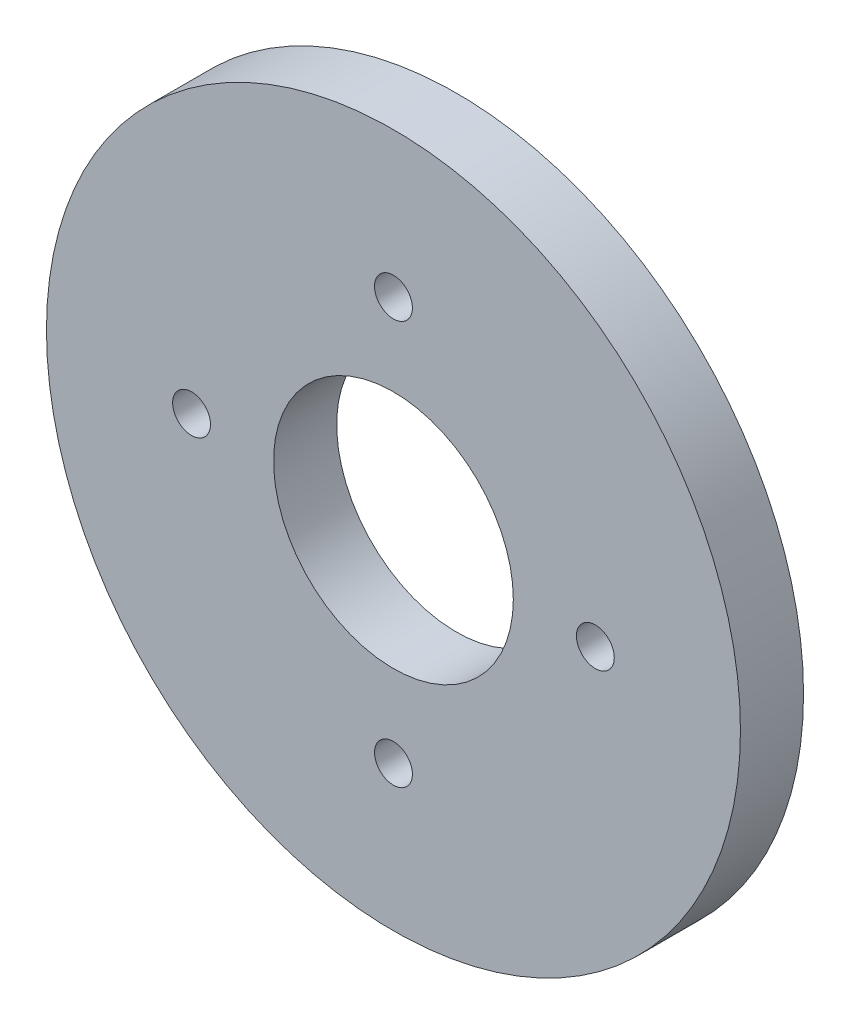
ISO-10303-21;
HEADER;
FILE_DESCRIPTION(('STEP AP214'),'2;1');
FILE_NAME('part.step','',(''),(''),'','','');
FILE_SCHEMA(('AUTOMOTIVE_DESIGN { 1 0 10303 214 1 1 1 1 }'));
ENDSEC;
DATA;
#1=APPLICATION_CONTEXT('core data for automotive mechanical design processes');
#2=APPLICATION_PROTOCOL_DEFINITION('international standard','automotive_design',2000,#1);
#3=PRODUCT_CONTEXT('',#1,'mechanical');
#4=PRODUCT('Part','Part','',(#3));
#5=PRODUCT_RELATED_PRODUCT_CATEGORY('part','',(#4));
#6=PRODUCT_DEFINITION_FORMATION('','',#4);
#7=PRODUCT_DEFINITION_CONTEXT('part definition',#1,'design');
#8=PRODUCT_DEFINITION('design','',#6,#7);
#9=PRODUCT_DEFINITION_SHAPE('','',#8);
#10=(LENGTH_UNIT() NAMED_UNIT(*) SI_UNIT(.MILLI.,.METRE.));
#11=(NAMED_UNIT(*) PLANE_ANGLE_UNIT() SI_UNIT($,.RADIAN.));
#12=(NAMED_UNIT(*) SI_UNIT($,.STERADIAN.) SOLID_ANGLE_UNIT());
#13=UNCERTAINTY_MEASURE_WITH_UNIT(LENGTH_MEASURE(1.E-05),#10,'distance_accuracy_value','');
#14=(GEOMETRIC_REPRESENTATION_CONTEXT(3) GLOBAL_UNCERTAINTY_ASSIGNED_CONTEXT((#13)) GLOBAL_UNIT_ASSIGNED_CONTEXT((#10,
#11,#12)) REPRESENTATION_CONTEXT('',''));
#15=CARTESIAN_POINT('',(0.,0.,0.));
#16=DIRECTION('',(0.,0.,1.));
#17=DIRECTION('',(1.,0.,0.));
#18=AXIS2_PLACEMENT_3D('',#15,#16,#17);
#19=CARTESIAN_POINT('',(0.,0.,5.));
#20=DIRECTION('',(0.,0.,1.));
#21=DIRECTION('',(1.,0.,0.));
#22=AXIS2_PLACEMENT_3D('',#19,#20,#21);
#23=PLANE('',#22);
#24=CARTESIAN_POINT('',(-15.9999999999998,0.,5.));
#25=DIRECTION('',(0.,0.,1.));
#26=DIRECTION('',(1.,0.,0.));
#27=AXIS2_PLACEMENT_3D('',#24,#25,#26);
#28=CIRCLE('',#27,1.5);
#29=CARTESIAN_POINT('',(-14.4999999999998,0.,5.));
#30=VERTEX_POINT('',#29);
#31=EDGE_CURVE('E68',#30,#30,#28,.T.);
#32=ORIENTED_EDGE('',*,*,#31,.F.);
#33=EDGE_LOOP('',(#32));
#34=FACE_BOUND('',#33,.T.);
#35=CARTESIAN_POINT('',(1.86816322561E-13,-16.,5.));
#36=DIRECTION('',(0.,0.,1.));
#37=DIRECTION('',(1.,0.,0.));
#38=AXIS2_PLACEMENT_3D('',#35,#36,#37);
#39=CIRCLE('',#38,1.5);
#40=CARTESIAN_POINT('',(1.50000000000019,-16.,5.));
#41=VERTEX_POINT('',#40);
#42=EDGE_CURVE('E62',#41,#41,#39,.T.);
#43=ORIENTED_EDGE('',*,*,#42,.F.);
#44=EDGE_LOOP('',(#43));
#45=FACE_BOUND('',#44,.T.);
#46=CARTESIAN_POINT('',(16.0000000000002,0.,5.));
#47=DIRECTION('',(0.,0.,1.));
#48=DIRECTION('',(1.,0.,0.));
#49=AXIS2_PLACEMENT_3D('',#46,#47,#48);
#50=CIRCLE('',#49,1.5);
#51=CARTESIAN_POINT('',(17.5000000000002,0.,5.));
#52=VERTEX_POINT('',#51);
#53=EDGE_CURVE('E56',#52,#52,#50,.T.);
#54=ORIENTED_EDGE('',*,*,#53,.F.);
#55=EDGE_LOOP('',(#54));
#56=FACE_BOUND('',#55,.T.);
#57=CARTESIAN_POINT('',(1.8667708399766E-13,16.,5.));
#58=DIRECTION('',(0.,0.,1.));
#59=DIRECTION('',(1.,0.,0.));
#60=AXIS2_PLACEMENT_3D('',#57,#58,#59);
#61=CIRCLE('',#60,1.5);
#62=CARTESIAN_POINT('',(1.50000000000019,16.,5.));
#63=VERTEX_POINT('',#62);
#64=EDGE_CURVE('E50',#63,#63,#61,.T.);
#65=ORIENTED_EDGE('',*,*,#64,.F.);
#66=EDGE_LOOP('',(#65));
#67=FACE_BOUND('',#66,.T.);
#68=CARTESIAN_POINT('',(0.,0.,5.));
#69=DIRECTION('',(0.,0.,1.));
#70=DIRECTION('',(1.,0.,0.));
#71=AXIS2_PLACEMENT_3D('',#68,#69,#70);
#72=CIRCLE('',#71,27.5);
#73=CARTESIAN_POINT('',(27.5,0.,5.));
#74=VERTEX_POINT('',#73);
#75=EDGE_CURVE('E10',#74,#74,#72,.T.);
#76=ORIENTED_EDGE('',*,*,#75,.T.);
#77=EDGE_LOOP('',(#76));
#78=FACE_BOUND('',#77,.T.);
#79=CARTESIAN_POINT('',(0.,0.,5.));
#80=DIRECTION('',(0.,0.,1.));
#81=DIRECTION('',(1.,0.,0.));
#82=AXIS2_PLACEMENT_3D('',#79,#80,#81);
#83=CIRCLE('',#82,9.5);
#84=CARTESIAN_POINT('',(9.5,0.,5.));
#85=VERTEX_POINT('',#84);
#86=EDGE_CURVE('E42',#85,#85,#83,.T.);
#87=ORIENTED_EDGE('',*,*,#86,.F.);
#88=EDGE_LOOP('',(#87));
#89=FACE_BOUND('',#88,.T.);
#90=ADVANCED_FACE('F31',(#34,#45,#56,#67,#78,#89),#23,.T.);
#91=CARTESIAN_POINT('',(0.,0.,0.));
#92=DIRECTION('',(0.,0.,1.));
#93=DIRECTION('',(1.,0.,0.));
#94=AXIS2_PLACEMENT_3D('',#91,#92,#93);
#95=PLANE('',#94);
#96=CARTESIAN_POINT('',(-15.9999999999998,0.,0.));
#97=DIRECTION('',(0.,0.,1.));
#98=DIRECTION('',(1.,0.,0.));
#99=AXIS2_PLACEMENT_3D('',#96,#97,#98);
#100=CIRCLE('',#99,1.5);
#101=CARTESIAN_POINT('',(-14.4999999999998,0.,0.));
#102=VERTEX_POINT('',#101);
#103=EDGE_CURVE('E65',#102,#102,#100,.T.);
#104=ORIENTED_EDGE('',*,*,#103,.T.);
#105=EDGE_LOOP('',(#104));
#106=FACE_BOUND('',#105,.T.);
#107=CARTESIAN_POINT('',(1.86816322561E-13,-16.,0.));
#108=DIRECTION('',(0.,0.,1.));
#109=DIRECTION('',(1.,0.,0.));
#110=AXIS2_PLACEMENT_3D('',#107,#108,#109);
#111=CIRCLE('',#110,1.5);
#112=CARTESIAN_POINT('',(1.50000000000019,-16.,0.));
#113=VERTEX_POINT('',#112);
#114=EDGE_CURVE('E59',#113,#113,#111,.T.);
#115=ORIENTED_EDGE('',*,*,#114,.T.);
#116=EDGE_LOOP('',(#115));
#117=FACE_BOUND('',#116,.T.);
#118=CARTESIAN_POINT('',(16.0000000000002,0.,0.));
#119=DIRECTION('',(0.,0.,1.));
#120=DIRECTION('',(1.,0.,0.));
#121=AXIS2_PLACEMENT_3D('',#118,#119,#120);
#122=CIRCLE('',#121,1.5);
#123=CARTESIAN_POINT('',(17.5000000000002,0.,0.));
#124=VERTEX_POINT('',#123);
#125=EDGE_CURVE('E53',#124,#124,#122,.T.);
#126=ORIENTED_EDGE('',*,*,#125,.T.);
#127=EDGE_LOOP('',(#126));
#128=FACE_BOUND('',#127,.T.);
#129=CARTESIAN_POINT('',(1.8667708399766E-13,16.,0.));
#130=DIRECTION('',(0.,0.,1.));
#131=DIRECTION('',(1.,0.,0.));
#132=AXIS2_PLACEMENT_3D('',#129,#130,#131);
#133=CIRCLE('',#132,1.5);
#134=CARTESIAN_POINT('',(1.50000000000019,16.,0.));
#135=VERTEX_POINT('',#134);
#136=EDGE_CURVE('E47',#135,#135,#133,.T.);
#137=ORIENTED_EDGE('',*,*,#136,.T.);
#138=EDGE_LOOP('',(#137));
#139=FACE_BOUND('',#138,.T.);
#140=CARTESIAN_POINT('',(0.,0.,0.));
#141=DIRECTION('',(0.,0.,1.));
#142=DIRECTION('',(1.,0.,0.));
#143=AXIS2_PLACEMENT_3D('',#140,#141,#142);
#144=CIRCLE('',#143,27.5);
#145=CARTESIAN_POINT('',(27.5,0.,0.));
#146=VERTEX_POINT('',#145);
#147=EDGE_CURVE('E35',#146,#146,#144,.T.);
#148=ORIENTED_EDGE('',*,*,#147,.F.);
#149=EDGE_LOOP('',(#148));
#150=FACE_BOUND('',#149,.T.);
#151=CARTESIAN_POINT('',(0.,0.,0.));
#152=DIRECTION('',(0.,0.,1.));
#153=DIRECTION('',(1.,0.,0.));
#154=AXIS2_PLACEMENT_3D('',#151,#152,#153);
#155=CIRCLE('',#154,9.5);
#156=CARTESIAN_POINT('',(9.5,0.,0.));
#157=VERTEX_POINT('',#156);
#158=EDGE_CURVE('E44',#157,#157,#155,.T.);
#159=ORIENTED_EDGE('',*,*,#158,.T.);
#160=EDGE_LOOP('',(#159));
#161=FACE_BOUND('',#160,.T.);
#162=ADVANCED_FACE('F74',(#106,#117,#128,#139,#150,#161),#95,.F.);
#163=CARTESIAN_POINT('',(0.,0.,5.));
#164=DIRECTION('',(0.,0.,-1.));
#165=DIRECTION('',(-1.,0.,0.));
#166=AXIS2_PLACEMENT_3D('',#163,#164,#165);
#167=CYLINDRICAL_SURFACE('',#166,27.5);
#168=ORIENTED_EDGE('',*,*,#75,.F.);
#169=EDGE_LOOP('',(#168));
#170=FACE_BOUND('',#169,.T.);
#171=ORIENTED_EDGE('',*,*,#147,.T.);
#172=EDGE_LOOP('',(#171));
#173=FACE_BOUND('',#172,.T.);
#174=ADVANCED_FACE('F33',(#170,#173),#167,.T.);
#175=CARTESIAN_POINT('',(0.,0.,5.));
#176=DIRECTION('',(0.,0.,-1.));
#177=DIRECTION('',(-1.,0.,0.));
#178=AXIS2_PLACEMENT_3D('',#175,#176,#177);
#179=CYLINDRICAL_SURFACE('',#178,9.5);
#180=ORIENTED_EDGE('',*,*,#86,.T.);
#181=EDGE_LOOP('',(#180));
#182=FACE_BOUND('',#181,.T.);
#183=ORIENTED_EDGE('',*,*,#158,.F.);
#184=EDGE_LOOP('',(#183));
#185=FACE_BOUND('',#184,.T.);
#186=ADVANCED_FACE('F95',(#182,#185),#179,.F.);
#187=CARTESIAN_POINT('',(1.8667708399766E-13,16.,0.));
#188=DIRECTION('',(0.,0.,1.));
#189=DIRECTION('',(1.,0.,0.));
#190=AXIS2_PLACEMENT_3D('',#187,#188,#189);
#191=CYLINDRICAL_SURFACE('',#190,1.5);
#192=ORIENTED_EDGE('',*,*,#136,.F.);
#193=EDGE_LOOP('',(#192));
#194=FACE_BOUND('',#193,.T.);
#195=ORIENTED_EDGE('',*,*,#64,.T.);
#196=EDGE_LOOP('',(#195));
#197=FACE_BOUND('',#196,.T.);
#198=ADVANCED_FACE('F98',(#194,#197),#191,.F.);
#199=CARTESIAN_POINT('',(16.0000000000002,0.,0.));
#200=DIRECTION('',(0.,0.,1.));
#201=DIRECTION('',(1.,0.,0.));
#202=AXIS2_PLACEMENT_3D('',#199,#200,#201);
#203=CYLINDRICAL_SURFACE('',#202,1.5);
#204=ORIENTED_EDGE('',*,*,#125,.F.);
#205=EDGE_LOOP('',(#204));
#206=FACE_BOUND('',#205,.T.);
#207=ORIENTED_EDGE('',*,*,#53,.T.);
#208=EDGE_LOOP('',(#207));
#209=FACE_BOUND('',#208,.T.);
#210=ADVANCED_FACE('F111',(#206,#209),#203,.F.);
#211=CARTESIAN_POINT('',(1.86816322561E-13,-16.,0.));
#212=DIRECTION('',(0.,0.,1.));
#213=DIRECTION('',(1.,0.,0.));
#214=AXIS2_PLACEMENT_3D('',#211,#212,#213);
#215=CYLINDRICAL_SURFACE('',#214,1.5);
#216=ORIENTED_EDGE('',*,*,#114,.F.);
#217=EDGE_LOOP('',(#216));
#218=FACE_BOUND('',#217,.T.);
#219=ORIENTED_EDGE('',*,*,#42,.T.);
#220=EDGE_LOOP('',(#219));
#221=FACE_BOUND('',#220,.T.);
#222=ADVANCED_FACE('F80',(#218,#221),#215,.F.);
#223=CARTESIAN_POINT('',(-15.9999999999998,0.,0.));
#224=DIRECTION('',(0.,0.,1.));
#225=DIRECTION('',(1.,0.,0.));
#226=AXIS2_PLACEMENT_3D('',#223,#224,#225);
#227=CYLINDRICAL_SURFACE('',#226,1.5);
#228=ORIENTED_EDGE('',*,*,#103,.F.);
#229=EDGE_LOOP('',(#228));
#230=FACE_BOUND('',#229,.T.);
#231=ORIENTED_EDGE('',*,*,#31,.T.);
#232=EDGE_LOOP('',(#231));
#233=FACE_BOUND('',#232,.T.);
#234=ADVANCED_FACE('F77',(#230,#233),#227,.F.);
#235=CLOSED_SHELL('',(#90,#162,#174,#186,#198,#210,#222,#234));
#236=MANIFOLD_SOLID_BREP('B2',#235);
#237=ADVANCED_BREP_SHAPE_REPRESENTATION('',(#18,#236),#14);
#238=SHAPE_DEFINITION_REPRESENTATION(#9,#237);
ENDSEC;
END-ISO-10303-21;
